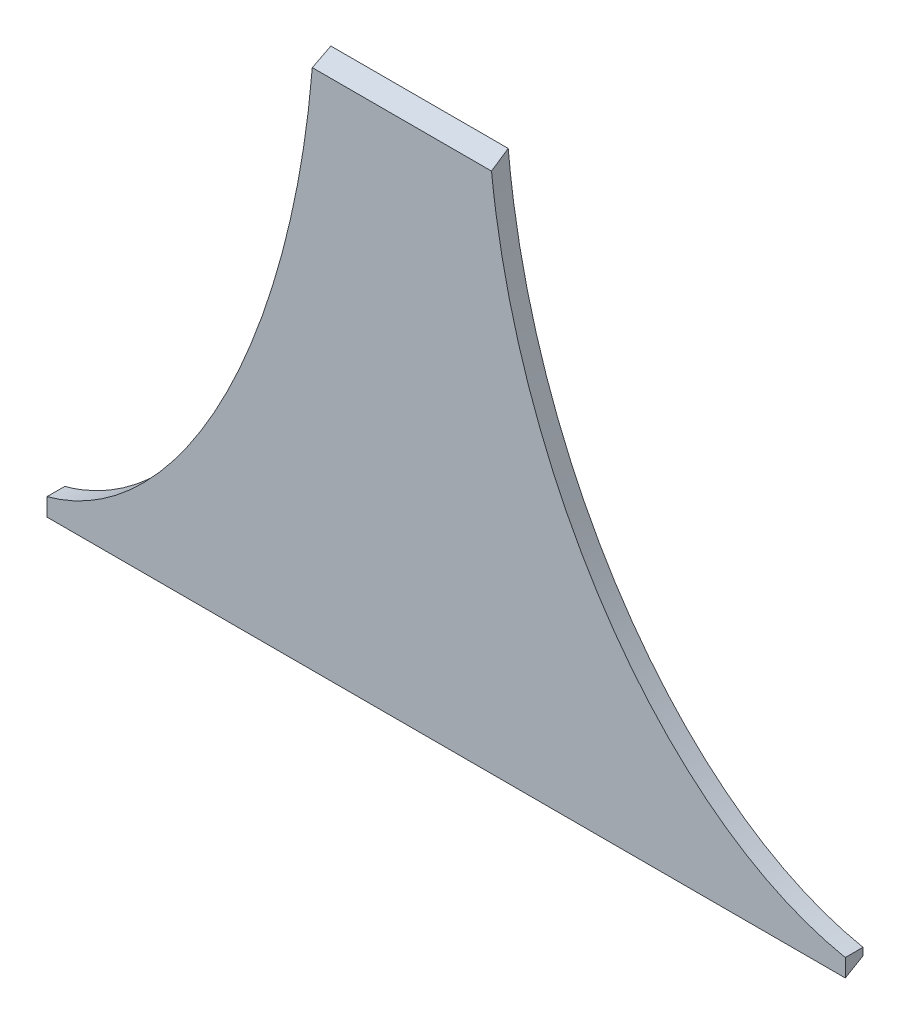
ISO-10303-21;
HEADER;
FILE_DESCRIPTION(('STEP AP214'),'2;1');
FILE_NAME('part.step','',(''),(''),'','','');
FILE_SCHEMA(('AUTOMOTIVE_DESIGN { 1 0 10303 214 1 1 1 1 }'));
ENDSEC;
DATA;
#1=APPLICATION_CONTEXT('core data for automotive mechanical design processes');
#2=APPLICATION_PROTOCOL_DEFINITION('international standard','automotive_design',2000,#1);
#3=PRODUCT_CONTEXT('',#1,'mechanical');
#4=PRODUCT('Part','Part','',(#3));
#5=PRODUCT_RELATED_PRODUCT_CATEGORY('part','',(#4));
#6=PRODUCT_DEFINITION_FORMATION('','',#4);
#7=PRODUCT_DEFINITION_CONTEXT('part definition',#1,'design');
#8=PRODUCT_DEFINITION('design','',#6,#7);
#9=PRODUCT_DEFINITION_SHAPE('','',#8);
#10=(LENGTH_UNIT() NAMED_UNIT(*) SI_UNIT(.MILLI.,.METRE.));
#11=(NAMED_UNIT(*) PLANE_ANGLE_UNIT() SI_UNIT($,.RADIAN.));
#12=(NAMED_UNIT(*) SI_UNIT($,.STERADIAN.) SOLID_ANGLE_UNIT());
#13=UNCERTAINTY_MEASURE_WITH_UNIT(LENGTH_MEASURE(1.E-05),#10,'distance_accuracy_value','');
#14=(GEOMETRIC_REPRESENTATION_CONTEXT(3) GLOBAL_UNCERTAINTY_ASSIGNED_CONTEXT((#13)) GLOBAL_UNIT_ASSIGNED_CONTEXT((#10,
#11,#12)) REPRESENTATION_CONTEXT('',''));
#15=CARTESIAN_POINT('',(0.,0.,0.));
#16=DIRECTION('',(0.,0.,1.));
#17=DIRECTION('',(1.,0.,0.));
#18=AXIS2_PLACEMENT_3D('',#15,#16,#17);
#19=CARTESIAN_POINT('',(0.,2.54,2.54));
#20=DIRECTION('',(-1.,0.,0.));
#21=DIRECTION('',(0.,-1.,0.));
#22=AXIS2_PLACEMENT_3D('',#19,#20,#21);
#23=PLANE('',#22);
#24=DIRECTION('',(0.,1.,0.));
#25=VECTOR('',#24,1.);
#26=CARTESIAN_POINT('',(0.,2.54,2.54));
#27=LINE('',#26,#25);
#28=CARTESIAN_POINT('',(0.,0.,2.54));
#29=VERTEX_POINT('',#28);
#30=CARTESIAN_POINT('',(0.,2.53999999999999,2.54));
#31=VERTEX_POINT('',#30);
#32=EDGE_CURVE('E94',#29,#31,#27,.T.);
#33=ORIENTED_EDGE('',*,*,#32,.F.);
#34=DIRECTION('',(0.,-0.499999999999995,0.866025403784442));
#35=VECTOR('',#34,1.);
#36=CARTESIAN_POINT('',(0.,0.,2.54));
#37=LINE('',#36,#35);
#38=CARTESIAN_POINT('',(0.,1.46646968374161,0.));
#39=VERTEX_POINT('',#38);
#40=EDGE_CURVE('E107',#39,#29,#37,.T.);
#41=ORIENTED_EDGE('',*,*,#40,.F.);
#42=DIRECTION('',(0.,1.,0.));
#43=VECTOR('',#42,1.);
#44=CARTESIAN_POINT('',(0.,2.54,0.));
#45=LINE('',#44,#43);
#46=CARTESIAN_POINT('',(0.,2.53999999999999,0.));
#47=VERTEX_POINT('',#46);
#48=EDGE_CURVE('E105',#39,#47,#45,.T.);
#49=ORIENTED_EDGE('',*,*,#48,.T.);
#50=DIRECTION('',(0.,0.,-1.));
#51=VECTOR('',#50,1.);
#52=CARTESIAN_POINT('',(0.,2.53999999999999,2.54));
#53=LINE('',#52,#51);
#54=EDGE_CURVE('E11',#31,#47,#53,.T.);
#55=ORIENTED_EDGE('',*,*,#54,.F.);
#56=EDGE_LOOP('',(#33,#41,#49,#55));
#57=FACE_BOUND('',#56,.T.);
#58=ADVANCED_FACE('F33',(#57),#23,.F.);
#59=CARTESIAN_POINT('',(0.,76.2,2.54));
#60=DIRECTION('',(0.,0.,-1.));
#61=DIRECTION('',(0.170698953122589,-0.985323229911308,0.));
#62=AXIS2_PLACEMENT_3D('',#59,#60,#61);
#63=ELLIPSE('',#62,74.9494584237923,50.3928366916649);
#64=DIRECTION('',(0.,0.,-1.));
#65=VECTOR('',#64,1.);
#66=SURFACE_OF_LINEAR_EXTRUSION('',#63,#65);
#67=CARTESIAN_POINT('',(0.,76.2,0.));
#68=DIRECTION('',(0.,0.,-1.));
#69=DIRECTION('',(0.170698953122589,-0.985323229911308,0.));
#70=AXIS2_PLACEMENT_3D('',#67,#68,#69);
#71=ELLIPSE('',#70,74.9494584237923,50.3928366916649);
#72=CARTESIAN_POINT('',(-50.8,76.2,0.));
#73=VERTEX_POINT('',#72);
#74=EDGE_CURVE('E102',#47,#73,#71,.T.);
#75=ORIENTED_EDGE('',*,*,#74,.T.);
#76=CARTESIAN_POINT('',(-50.8,76.2,0.));
#77=CARTESIAN_POINT('',(-50.7771057322592,75.9555471470043,0.423404761443671));
#78=CARTESIAN_POINT('',(-50.7533899173618,75.711114913528,0.846773808832174));
#79=CARTESIAN_POINT('',(-50.7043151932534,75.2222916856141,1.69344047549884));
#80=CARTESIAN_POINT('',(-50.6789562840425,74.9779006911766,2.11673809477701));
#81=CARTESIAN_POINT('',(-50.6527758276749,74.7335303162583,2.54));
#82=B_SPLINE_CURVE_WITH_KNOTS('',3,(#76,#77,#78,#79,#80,#81),.UNSPECIFIED.,.F.,.F.,(4,2,4),(0.,
1.4683181407059,2.9366362814118),.UNSPECIFIED.);
#83=CARTESIAN_POINT('',(-50.6527758276749,74.7335303162584,2.54));
#84=VERTEX_POINT('',#83);
#85=EDGE_CURVE('E128',#73,#84,#82,.T.);
#86=ORIENTED_EDGE('',*,*,#85,.T.);
#87=EDGE_CURVE('E97',#31,#84,#63,.T.);
#88=ORIENTED_EDGE('',*,*,#87,.F.);
#89=ORIENTED_EDGE('',*,*,#54,.T.);
#90=EDGE_LOOP('',(#75,#86,#88,#89));
#91=FACE_BOUND('',#90,.T.);
#92=ADVANCED_FACE('F118',(#91),#66,.F.);
#93=CARTESIAN_POINT('',(-114.3,76.2,2.54));
#94=DIRECTION('',(0.,0.,-1.));
#95=DIRECTION('',(-0.0965576982497223,-0.995327388806676,0.));
#96=AXIS2_PLACEMENT_3D('',#93,#94,#95);
#97=ELLIPSE('',#96,74.6370644129135,37.9681230999385);
#98=DIRECTION('',(0.,0.,-1.));
#99=VECTOR('',#98,1.);
#100=SURFACE_OF_LINEAR_EXTRUSION('',#97,#99);
#101=CARTESIAN_POINT('',(-76.3125986682456,74.7335303162584,2.54));
#102=VERTEX_POINT('',#101);
#103=CARTESIAN_POINT('',(-114.3,2.53999999999999,2.54));
#104=VERTEX_POINT('',#103);
#105=EDGE_CURVE('E56',#102,#104,#97,.T.);
#106=ORIENTED_EDGE('',*,*,#105,.F.);
#107=CARTESIAN_POINT('',(-76.3125986682456,74.7335303162584,2.54));
#108=CARTESIAN_POINT('',(-76.2925996104968,74.9779182695511,2.11670764813918));
#109=CARTESIAN_POINT('',(-76.2732168592686,75.222318053176,1.6933948055421));
#110=CARTESIAN_POINT('',(-76.2356839698534,75.7111412810898,0.846728138875429));
#111=CARTESIAN_POINT('',(-76.2175338316664,75.9555647253789,0.423374314805841));
#112=CARTESIAN_POINT('',(-76.2,76.2,0.));
#113=B_SPLINE_CURVE_WITH_KNOTS('',3,(#107,#108,#109,#110,#111,#112),.UNSPECIFIED.,.F.,.F.,(4,2,
4),(0.,1.46755114796657,2.93510229593313),.UNSPECIFIED.);
#114=CARTESIAN_POINT('',(-76.2,76.2,0.));
#115=VERTEX_POINT('',#114);
#116=EDGE_CURVE('E79',#102,#115,#113,.T.);
#117=ORIENTED_EDGE('',*,*,#116,.T.);
#118=CARTESIAN_POINT('',(-114.3,76.2,0.));
#119=DIRECTION('',(0.,0.,-1.));
#120=DIRECTION('',(-0.0965576982497223,-0.995327388806676,0.));
#121=AXIS2_PLACEMENT_3D('',#118,#119,#120);
#122=ELLIPSE('',#121,74.6370644129135,37.9681230999385);
#123=CARTESIAN_POINT('',(-114.3,2.53999999999999,0.));
#124=VERTEX_POINT('',#123);
#125=EDGE_CURVE('E73',#115,#124,#122,.T.);
#126=ORIENTED_EDGE('',*,*,#125,.T.);
#127=DIRECTION('',(0.,0.,-1.));
#128=VECTOR('',#127,1.);
#129=CARTESIAN_POINT('',(-114.3,2.53999999999999,2.54));
#130=LINE('',#129,#128);
#131=EDGE_CURVE('E40',#104,#124,#130,.T.);
#132=ORIENTED_EDGE('',*,*,#131,.F.);
#133=EDGE_LOOP('',(#106,#117,#126,#132));
#134=FACE_BOUND('',#133,.T.);
#135=ADVANCED_FACE('F75',(#134),#100,.F.);
#136=CARTESIAN_POINT('',(-114.3,0.,2.54));
#137=DIRECTION('',(1.,0.,0.));
#138=DIRECTION('',(0.,0.,-1.));
#139=AXIS2_PLACEMENT_3D('',#136,#137,#138);
#140=PLANE('',#139);
#141=DIRECTION('',(0.,-1.,0.));
#142=VECTOR('',#141,1.);
#143=CARTESIAN_POINT('',(-114.3,0.,0.));
#144=LINE('',#143,#142);
#145=CARTESIAN_POINT('',(-114.3,1.46646968374162,0.));
#146=VERTEX_POINT('',#145);
#147=EDGE_CURVE('E83',#124,#146,#144,.T.);
#148=ORIENTED_EDGE('',*,*,#147,.T.);
#149=DIRECTION('',(0.,0.499999999999995,-0.866025403784442));
#150=VECTOR('',#149,1.);
#151=CARTESIAN_POINT('',(-114.3,0.,2.54));
#152=LINE('',#151,#150);
#153=CARTESIAN_POINT('',(-114.3,0.,2.54));
#154=VERTEX_POINT('',#153);
#155=EDGE_CURVE('E47',#154,#146,#152,.T.);
#156=ORIENTED_EDGE('',*,*,#155,.F.);
#157=DIRECTION('',(0.,-1.,0.));
#158=VECTOR('',#157,1.);
#159=CARTESIAN_POINT('',(-114.3,0.,2.54));
#160=LINE('',#159,#158);
#161=EDGE_CURVE('E89',#104,#154,#160,.T.);
#162=ORIENTED_EDGE('',*,*,#161,.F.);
#163=ORIENTED_EDGE('',*,*,#131,.T.);
#164=EDGE_LOOP('',(#148,#156,#162,#163));
#165=FACE_BOUND('',#164,.T.);
#166=ADVANCED_FACE('F88',(#165),#140,.F.);
#167=CARTESIAN_POINT('',(-114.3,76.2,2.54));
#168=DIRECTION('',(0.,0.,1.));
#169=DIRECTION('',(1.,0.,0.));
#170=AXIS2_PLACEMENT_3D('',#167,#168,#169);
#171=PLANE('',#170);
#172=DIRECTION('',(-1.,0.,0.));
#173=VECTOR('',#172,1.);
#174=CARTESIAN_POINT('',(-36.322,74.7335303162584,2.54));
#175=LINE('',#174,#173);
#176=EDGE_CURVE('E129',#84,#102,#175,.T.);
#177=ORIENTED_EDGE('',*,*,#176,.T.);
#178=ORIENTED_EDGE('',*,*,#105,.T.);
#179=ORIENTED_EDGE('',*,*,#161,.T.);
#180=DIRECTION('',(1.,0.,0.));
#181=VECTOR('',#180,1.);
#182=CARTESIAN_POINT('',(0.,0.,2.54));
#183=LINE('',#182,#181);
#184=EDGE_CURVE('E90',#154,#29,#183,.T.);
#185=ORIENTED_EDGE('',*,*,#184,.T.);
#186=ORIENTED_EDGE('',*,*,#32,.T.);
#187=ORIENTED_EDGE('',*,*,#87,.T.);
#188=EDGE_LOOP('',(#177,#178,#179,#185,#186,#187));
#189=FACE_BOUND('',#188,.T.);
#190=ADVANCED_FACE('F143',(#189),#171,.T.);
#191=CARTESIAN_POINT('',(-114.3,76.2,0.));
#192=DIRECTION('',(0.,0.,1.));
#193=DIRECTION('',(1.,0.,0.));
#194=AXIS2_PLACEMENT_3D('',#191,#192,#193);
#195=PLANE('',#194);
#196=ORIENTED_EDGE('',*,*,#48,.F.);
#197=DIRECTION('',(-1.,0.,0.));
#198=VECTOR('',#197,1.);
#199=CARTESIAN_POINT('',(0.001000000000001,1.46646968374161,0.));
#200=LINE('',#199,#198);
#201=EDGE_CURVE('E93',#39,#146,#200,.T.);
#202=ORIENTED_EDGE('',*,*,#201,.T.);
#203=ORIENTED_EDGE('',*,*,#147,.F.);
#204=ORIENTED_EDGE('',*,*,#125,.F.);
#205=DIRECTION('',(-1.,0.,0.));
#206=VECTOR('',#205,1.);
#207=CARTESIAN_POINT('',(-50.8,76.2,0.));
#208=LINE('',#207,#206);
#209=EDGE_CURVE('E84',#73,#115,#208,.T.);
#210=ORIENTED_EDGE('',*,*,#209,.F.);
#211=ORIENTED_EDGE('',*,*,#74,.F.);
#212=EDGE_LOOP('',(#196,#202,#203,#204,#210,#211));
#213=FACE_BOUND('',#212,.T.);
#214=ADVANCED_FACE('F92',(#213),#195,.F.);
#215=CARTESIAN_POINT('',(0.001000000000001,0.,2.54));
#216=DIRECTION('',(0.,0.866025403784442,0.499999999999995));
#217=DIRECTION('',(0.,-0.499999999999995,0.866025403784442));
#218=AXIS2_PLACEMENT_3D('',#215,#216,#217);
#219=PLANE('',#218);
#220=ORIENTED_EDGE('',*,*,#40,.T.);
#221=ORIENTED_EDGE('',*,*,#184,.F.);
#222=ORIENTED_EDGE('',*,*,#155,.T.);
#223=ORIENTED_EDGE('',*,*,#201,.F.);
#224=EDGE_LOOP('',(#220,#221,#222,#223));
#225=FACE_BOUND('',#224,.T.);
#226=ADVANCED_FACE('F138',(#225),#219,.F.);
#227=CARTESIAN_POINT('',(-36.322,76.2,0.));
#228=DIRECTION('',(0.,-0.866025403784441,-0.499999999999995));
#229=DIRECTION('',(0.,0.499999999999995,-0.866025403784441));
#230=AXIS2_PLACEMENT_3D('',#227,#228,#229);
#231=PLANE('',#230);
#232=ORIENTED_EDGE('',*,*,#209,.T.);
#233=ORIENTED_EDGE('',*,*,#116,.F.);
#234=ORIENTED_EDGE('',*,*,#176,.F.);
#235=ORIENTED_EDGE('',*,*,#85,.F.);
#236=EDGE_LOOP('',(#232,#233,#234,#235));
#237=FACE_BOUND('',#236,.T.);
#238=ADVANCED_FACE('F134',(#237),#231,.F.);
#239=CLOSED_SHELL('',(#58,#92,#135,#166,#190,#214,#226,#238));
#240=MANIFOLD_SOLID_BREP('B2',#239);
#241=ADVANCED_BREP_SHAPE_REPRESENTATION('',(#18,#240),#14);
#242=SHAPE_DEFINITION_REPRESENTATION(#9,#241);
ENDSEC;
END-ISO-10303-21;
